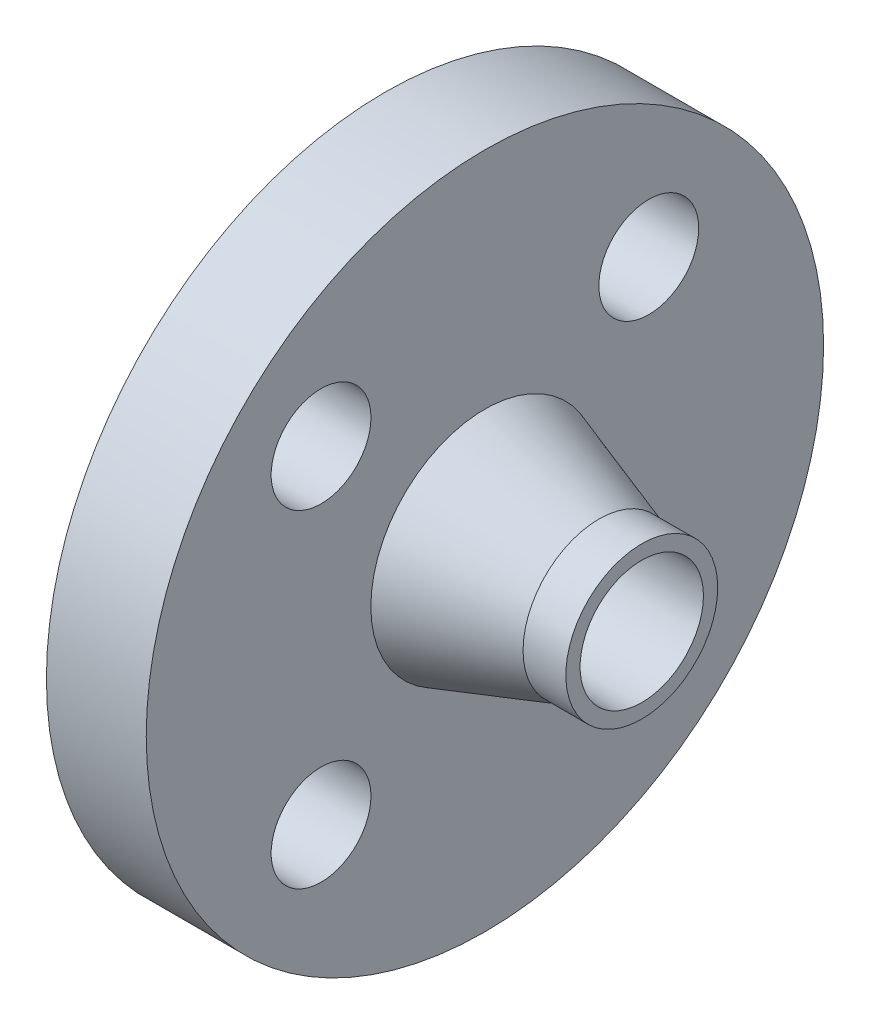
ISO-10303-21;
HEADER;
FILE_DESCRIPTION(('STEP AP214'),'2;1');
FILE_NAME('part.step','',(''),(''),'','','');
FILE_SCHEMA(('AUTOMOTIVE_DESIGN { 1 0 10303 214 1 1 1 1 }'));
ENDSEC;
DATA;
#1=APPLICATION_CONTEXT('core data for automotive mechanical design processes');
#2=APPLICATION_PROTOCOL_DEFINITION('international standard','automotive_design',2000,#1);
#3=PRODUCT_CONTEXT('',#1,'mechanical');
#4=PRODUCT('Part','Part','',(#3));
#5=PRODUCT_RELATED_PRODUCT_CATEGORY('part','',(#4));
#6=PRODUCT_DEFINITION_FORMATION('','',#4);
#7=PRODUCT_DEFINITION_CONTEXT('part definition',#1,'design');
#8=PRODUCT_DEFINITION('design','',#6,#7);
#9=PRODUCT_DEFINITION_SHAPE('','',#8);
#10=(LENGTH_UNIT() NAMED_UNIT(*) SI_UNIT(.MILLI.,.METRE.));
#11=(NAMED_UNIT(*) PLANE_ANGLE_UNIT() SI_UNIT($,.RADIAN.));
#12=(NAMED_UNIT(*) SI_UNIT($,.STERADIAN.) SOLID_ANGLE_UNIT());
#13=UNCERTAINTY_MEASURE_WITH_UNIT(LENGTH_MEASURE(1.E-05),#10,'distance_accuracy_value','');
#14=(GEOMETRIC_REPRESENTATION_CONTEXT(3) GLOBAL_UNCERTAINTY_ASSIGNED_CONTEXT((#13)) GLOBAL_UNIT_ASSIGNED_CONTEXT((#10,
#11,#12)) REPRESENTATION_CONTEXT('',''));
#15=CARTESIAN_POINT('',(0.,0.,0.));
#16=DIRECTION('',(0.,0.,1.));
#17=DIRECTION('',(1.,0.,0.));
#18=AXIS2_PLACEMENT_3D('',#15,#16,#17);
#19=CARTESIAN_POINT('',(0.,15.575,0.));
#20=DIRECTION('',(-1.,0.,0.));
#21=DIRECTION('',(0.,0.,1.));
#22=AXIS2_PLACEMENT_3D('',#19,#20,#21);
#23=PLANE('',#22);
#24=CARTESIAN_POINT('',(0.,0.,0.));
#25=DIRECTION('',(1.,0.,0.));
#26=DIRECTION('',(0.,0.,-1.));
#27=AXIS2_PLACEMENT_3D('',#24,#25,#26);
#28=CIRCLE('',#27,8.65);
#29=CARTESIAN_POINT('',(0.,0.,-8.65));
#30=VERTEX_POINT('',#29);
#31=EDGE_CURVE('E18',#30,#30,#28,.T.);
#32=ORIENTED_EDGE('',*,*,#31,.T.);
#33=EDGE_LOOP('',(#32));
#34=FACE_BOUND('',#33,.T.);
#35=CARTESIAN_POINT('',(0.,0.,0.));
#36=DIRECTION('',(1.,0.,0.));
#37=DIRECTION('',(0.,0.,-1.));
#38=AXIS2_PLACEMENT_3D('',#35,#36,#37);
#39=CIRCLE('',#38,22.5);
#40=CARTESIAN_POINT('',(0.,0.,-22.5));
#41=VERTEX_POINT('',#40);
#42=EDGE_CURVE('E68',#41,#41,#39,.T.);
#43=ORIENTED_EDGE('',*,*,#42,.F.);
#44=EDGE_LOOP('',(#43));
#45=FACE_BOUND('',#44,.T.);
#46=ADVANCED_FACE('F15',(#34,#45),#23,.T.);
#47=CARTESIAN_POINT('',(19.,0.,0.));
#48=DIRECTION('',(1.,0.,0.));
#49=DIRECTION('',(0.,0.,-1.));
#50=AXIS2_PLACEMENT_3D('',#47,#48,#49);
#51=CYLINDRICAL_SURFACE('',#50,8.65);
#52=CARTESIAN_POINT('',(38.,0.,0.));
#53=DIRECTION('',(1.,0.,0.));
#54=DIRECTION('',(0.,0.,-1.));
#55=AXIS2_PLACEMENT_3D('',#52,#53,#54);
#56=CIRCLE('',#55,8.65);
#57=CARTESIAN_POINT('',(38.,0.,-8.65));
#58=VERTEX_POINT('',#57);
#59=EDGE_CURVE('E66',#58,#58,#56,.F.);
#60=ORIENTED_EDGE('',*,*,#59,.F.);
#61=EDGE_LOOP('',(#60));
#62=FACE_BOUND('',#61,.T.);
#63=ORIENTED_EDGE('',*,*,#31,.F.);
#64=EDGE_LOOP('',(#63));
#65=FACE_BOUND('',#64,.T.);
#66=ADVANCED_FACE('F77',(#62,#65),#51,.F.);
#67=CARTESIAN_POINT('',(0.999999999999995,0.,0.));
#68=DIRECTION('',(1.,0.,0.));
#69=DIRECTION('',(0.,0.,-1.));
#70=AXIS2_PLACEMENT_3D('',#67,#68,#69);
#71=CYLINDRICAL_SURFACE('',#70,22.5);
#72=ORIENTED_EDGE('',*,*,#42,.T.);
#73=EDGE_LOOP('',(#72));
#74=FACE_BOUND('',#73,.T.);
#75=CARTESIAN_POINT('',(1.99999999999999,0.,0.));
#76=DIRECTION('',(1.,0.,0.));
#77=DIRECTION('',(0.,0.,-1.));
#78=AXIS2_PLACEMENT_3D('',#75,#76,#77);
#79=CIRCLE('',#78,22.5);
#80=CARTESIAN_POINT('',(1.99999999999999,0.,-22.5));
#81=VERTEX_POINT('',#80);
#82=EDGE_CURVE('E63',#81,#81,#79,.T.);
#83=ORIENTED_EDGE('',*,*,#82,.F.);
#84=EDGE_LOOP('',(#83));
#85=FACE_BOUND('',#84,.T.);
#86=ADVANCED_FACE('F79',(#74,#85),#71,.T.);
#87=CARTESIAN_POINT('',(38.,9.65,0.));
#88=DIRECTION('',(1.,0.,0.));
#89=DIRECTION('',(0.,0.,-1.));
#90=AXIS2_PLACEMENT_3D('',#87,#88,#89);
#91=PLANE('',#90);
#92=ORIENTED_EDGE('',*,*,#59,.T.);
#93=EDGE_LOOP('',(#92));
#94=FACE_BOUND('',#93,.T.);
#95=CARTESIAN_POINT('',(38.,0.,0.));
#96=DIRECTION('',(1.,0.,0.));
#97=DIRECTION('',(0.,0.,-1.));
#98=AXIS2_PLACEMENT_3D('',#95,#96,#97);
#99=CIRCLE('',#98,10.65);
#100=CARTESIAN_POINT('',(38.,0.,-10.65));
#101=VERTEX_POINT('',#100);
#102=EDGE_CURVE('E60',#101,#101,#99,.F.);
#103=ORIENTED_EDGE('',*,*,#102,.F.);
#104=EDGE_LOOP('',(#103));
#105=FACE_BOUND('',#104,.T.);
#106=ADVANCED_FACE('F86',(#94,#105),#91,.T.);
#107=CARTESIAN_POINT('',(1.99999999999999,35.,0.));
#108=DIRECTION('',(-1.,0.,0.));
#109=DIRECTION('',(0.,0.,1.));
#110=AXIS2_PLACEMENT_3D('',#107,#108,#109);
#111=PLANE('',#110);
#112=ORIENTED_EDGE('',*,*,#82,.T.);
#113=EDGE_LOOP('',(#112));
#114=FACE_BOUND('',#113,.T.);
#115=CARTESIAN_POINT('',(1.99999999999999,22.9809703885628,22.9809703885628));
#116=DIRECTION('',(1.,0.,0.));
#117=DIRECTION('',(0.,0.,-1.));
#118=AXIS2_PLACEMENT_3D('',#115,#116,#117);
#119=CIRCLE('',#118,7.);
#120=CARTESIAN_POINT('',(1.99999999999999,22.9809703885628,15.9809703885628));
#121=VERTEX_POINT('',#120);
#122=EDGE_CURVE('E45',#121,#121,#119,.T.);
#123=ORIENTED_EDGE('',*,*,#122,.T.);
#124=EDGE_LOOP('',(#123));
#125=FACE_BOUND('',#124,.T.);
#126=CARTESIAN_POINT('',(1.99999999999999,-22.9809703885628,22.9809703885628));
#127=DIRECTION('',(1.,0.,0.));
#128=DIRECTION('',(0.,0.,-1.));
#129=AXIS2_PLACEMENT_3D('',#126,#127,#128);
#130=CIRCLE('',#129,7.);
#131=CARTESIAN_POINT('',(1.99999999999999,-22.9809703885628,15.9809703885628));
#132=VERTEX_POINT('',#131);
#133=EDGE_CURVE('E48',#132,#132,#130,.T.);
#134=ORIENTED_EDGE('',*,*,#133,.T.);
#135=EDGE_LOOP('',(#134));
#136=FACE_BOUND('',#135,.T.);
#137=CARTESIAN_POINT('',(1.99999999999999,-22.9809703885628,-22.9809703885628));
#138=DIRECTION('',(1.,0.,0.));
#139=DIRECTION('',(0.,0.,-1.));
#140=AXIS2_PLACEMENT_3D('',#137,#138,#139);
#141=CIRCLE('',#140,7.);
#142=CARTESIAN_POINT('',(1.99999999999999,-22.9809703885628,-29.9809703885628));
#143=VERTEX_POINT('',#142);
#144=EDGE_CURVE('E51',#143,#143,#141,.T.);
#145=ORIENTED_EDGE('',*,*,#144,.T.);
#146=EDGE_LOOP('',(#145));
#147=FACE_BOUND('',#146,.T.);
#148=CARTESIAN_POINT('',(1.99999999999999,22.9809703885628,-22.9809703885628));
#149=DIRECTION('',(1.,0.,0.));
#150=DIRECTION('',(0.,0.,-1.));
#151=AXIS2_PLACEMENT_3D('',#148,#149,#150);
#152=CIRCLE('',#151,7.);
#153=CARTESIAN_POINT('',(1.99999999999999,22.9809703885628,-29.9809703885628));
#154=VERTEX_POINT('',#153);
#155=EDGE_CURVE('E54',#154,#154,#152,.T.);
#156=ORIENTED_EDGE('',*,*,#155,.T.);
#157=EDGE_LOOP('',(#156));
#158=FACE_BOUND('',#157,.T.);
#159=CARTESIAN_POINT('',(1.99999999999999,0.,0.));
#160=DIRECTION('',(1.,0.,0.));
#161=DIRECTION('',(0.,0.,-1.));
#162=AXIS2_PLACEMENT_3D('',#159,#160,#161);
#163=CIRCLE('',#162,47.5);
#164=CARTESIAN_POINT('',(1.99999999999999,0.,-47.5));
#165=VERTEX_POINT('',#164);
#166=EDGE_CURVE('E57',#165,#165,#163,.T.);
#167=ORIENTED_EDGE('',*,*,#166,.F.);
#168=EDGE_LOOP('',(#167));
#169=FACE_BOUND('',#168,.T.);
#170=ADVANCED_FACE('F123',(#114,#125,#136,#147,#158,#169),#111,.T.);
#171=CARTESIAN_POINT('',(35.,0.,0.));
#172=DIRECTION('',(1.,0.,0.));
#173=DIRECTION('',(0.,0.,-1.));
#174=AXIS2_PLACEMENT_3D('',#171,#172,#173);
#175=CYLINDRICAL_SURFACE('',#174,10.65);
#176=CARTESIAN_POINT('',(32.0000000009863,0.,0.));
#177=DIRECTION('',(-1.,0.,0.));
#178=DIRECTION('',(0.,1.,0.));
#179=AXIS2_PLACEMENT_3D('',#176,#177,#178);
#180=CIRCLE('',#179,10.6500000029498);
#181=CARTESIAN_POINT('',(32.0000000009863,10.6500000029498,0.));
#182=VERTEX_POINT('',#181);
#183=EDGE_CURVE('E44',#182,#182,#180,.T.);
#184=ORIENTED_EDGE('',*,*,#183,.F.);
#185=EDGE_LOOP('',(#184));
#186=FACE_BOUND('',#185,.T.);
#187=ORIENTED_EDGE('',*,*,#102,.T.);
#188=EDGE_LOOP('',(#187));
#189=FACE_BOUND('',#188,.T.);
#190=ADVANCED_FACE('F119',(#186,#189),#175,.T.);
#191=CARTESIAN_POINT('',(8.99999999999999,0.,0.));
#192=DIRECTION('',(1.,0.,0.));
#193=DIRECTION('',(0.,0.,-1.));
#194=AXIS2_PLACEMENT_3D('',#191,#192,#193);
#195=CYLINDRICAL_SURFACE('',#194,47.5);
#196=ORIENTED_EDGE('',*,*,#166,.T.);
#197=EDGE_LOOP('',(#196));
#198=FACE_BOUND('',#197,.T.);
#199=CARTESIAN_POINT('',(16.,0.,0.));
#200=DIRECTION('',(1.,0.,0.));
#201=DIRECTION('',(0.,0.,-1.));
#202=AXIS2_PLACEMENT_3D('',#199,#200,#201);
#203=CIRCLE('',#202,47.5);
#204=CARTESIAN_POINT('',(16.,0.,-47.5));
#205=VERTEX_POINT('',#204);
#206=EDGE_CURVE('E41',#205,#205,#203,.T.);
#207=ORIENTED_EDGE('',*,*,#206,.F.);
#208=EDGE_LOOP('',(#207));
#209=FACE_BOUND('',#208,.T.);
#210=ADVANCED_FACE('F115',(#198,#209),#195,.T.);
#211=CARTESIAN_POINT('',(1.99999999999999,22.9809703885628,-22.9809703885628));
#212=DIRECTION('',(1.,0.,0.));
#213=DIRECTION('',(0.,0.,-1.));
#214=AXIS2_PLACEMENT_3D('',#211,#212,#213);
#215=CYLINDRICAL_SURFACE('',#214,7.);
#216=ORIENTED_EDGE('',*,*,#155,.F.);
#217=EDGE_LOOP('',(#216));
#218=FACE_BOUND('',#217,.T.);
#219=CARTESIAN_POINT('',(16.,22.9809703885628,-22.9809703885628));
#220=DIRECTION('',(1.,0.,0.));
#221=DIRECTION('',(0.,0.,-1.));
#222=AXIS2_PLACEMENT_3D('',#219,#220,#221);
#223=CIRCLE('',#222,7.);
#224=CARTESIAN_POINT('',(16.,22.9809703885628,-29.9809703885628));
#225=VERTEX_POINT('',#224);
#226=EDGE_CURVE('E38',#225,#225,#223,.F.);
#227=ORIENTED_EDGE('',*,*,#226,.F.);
#228=EDGE_LOOP('',(#227));
#229=FACE_BOUND('',#228,.T.);
#230=ADVANCED_FACE('F111',(#218,#229),#215,.F.);
#231=CARTESIAN_POINT('',(1.99999999999999,-22.9809703885628,-22.9809703885628));
#232=DIRECTION('',(1.,0.,0.));
#233=DIRECTION('',(0.,0.,-1.));
#234=AXIS2_PLACEMENT_3D('',#231,#232,#233);
#235=CYLINDRICAL_SURFACE('',#234,7.);
#236=ORIENTED_EDGE('',*,*,#144,.F.);
#237=EDGE_LOOP('',(#236));
#238=FACE_BOUND('',#237,.T.);
#239=CARTESIAN_POINT('',(16.,-22.9809703885628,-22.9809703885628));
#240=DIRECTION('',(1.,0.,0.));
#241=DIRECTION('',(0.,0.,-1.));
#242=AXIS2_PLACEMENT_3D('',#239,#240,#241);
#243=CIRCLE('',#242,7.);
#244=CARTESIAN_POINT('',(16.,-22.9809703885628,-29.9809703885628));
#245=VERTEX_POINT('',#244);
#246=EDGE_CURVE('E35',#245,#245,#243,.F.);
#247=ORIENTED_EDGE('',*,*,#246,.F.);
#248=EDGE_LOOP('',(#247));
#249=FACE_BOUND('',#248,.T.);
#250=ADVANCED_FACE('F107',(#238,#249),#235,.F.);
#251=CARTESIAN_POINT('',(1.99999999999999,-22.9809703885628,22.9809703885628));
#252=DIRECTION('',(1.,0.,0.));
#253=DIRECTION('',(0.,0.,-1.));
#254=AXIS2_PLACEMENT_3D('',#251,#252,#253);
#255=CYLINDRICAL_SURFACE('',#254,7.);
#256=ORIENTED_EDGE('',*,*,#133,.F.);
#257=EDGE_LOOP('',(#256));
#258=FACE_BOUND('',#257,.T.);
#259=CARTESIAN_POINT('',(16.,-22.9809703885628,22.9809703885628));
#260=DIRECTION('',(1.,0.,0.));
#261=DIRECTION('',(0.,0.,-1.));
#262=AXIS2_PLACEMENT_3D('',#259,#260,#261);
#263=CIRCLE('',#262,7.);
#264=CARTESIAN_POINT('',(16.,-22.9809703885628,15.9809703885628));
#265=VERTEX_POINT('',#264);
#266=EDGE_CURVE('E27',#265,#265,#263,.F.);
#267=ORIENTED_EDGE('',*,*,#266,.F.);
#268=EDGE_LOOP('',(#267));
#269=FACE_BOUND('',#268,.T.);
#270=ADVANCED_FACE('F103',(#258,#269),#255,.F.);
#271=CARTESIAN_POINT('',(1.99999999999999,22.9809703885628,22.9809703885628));
#272=DIRECTION('',(1.,0.,0.));
#273=DIRECTION('',(0.,0.,-1.));
#274=AXIS2_PLACEMENT_3D('',#271,#272,#273);
#275=CYLINDRICAL_SURFACE('',#274,7.);
#276=ORIENTED_EDGE('',*,*,#122,.F.);
#277=EDGE_LOOP('',(#276));
#278=FACE_BOUND('',#277,.T.);
#279=CARTESIAN_POINT('',(16.,22.9809703885628,22.9809703885628));
#280=DIRECTION('',(1.,0.,0.));
#281=DIRECTION('',(0.,0.,-1.));
#282=AXIS2_PLACEMENT_3D('',#279,#280,#281);
#283=CIRCLE('',#282,7.);
#284=CARTESIAN_POINT('',(16.,22.9809703885628,15.9809703885628));
#285=VERTEX_POINT('',#284);
#286=EDGE_CURVE('E22',#285,#285,#283,.F.);
#287=ORIENTED_EDGE('',*,*,#286,.F.);
#288=EDGE_LOOP('',(#287));
#289=FACE_BOUND('',#288,.T.);
#290=ADVANCED_FACE('F96',(#278,#289),#275,.F.);
#291=CARTESIAN_POINT('',(15.9999999990137,0.,0.));
#292=DIRECTION('',(-1.,0.,0.));
#293=DIRECTION('',(0.,0.,1.));
#294=AXIS2_PLACEMENT_3D('',#291,#292,#293);
#295=CONICAL_SURFACE('',#294,15.9999999970502,0.322687760876291);
#296=CARTESIAN_POINT('',(15.9999999990137,0.,0.));
#297=DIRECTION('',(-1.,0.,0.));
#298=DIRECTION('',(0.,0.,1.));
#299=AXIS2_PLACEMENT_3D('',#296,#297,#298);
#300=CIRCLE('',#299,15.9999999970502);
#301=CARTESIAN_POINT('',(15.9999999990137,0.,15.9999999970502));
#302=VERTEX_POINT('',#301);
#303=EDGE_CURVE('E10',#302,#302,#300,.T.);
#304=ORIENTED_EDGE('',*,*,#303,.F.);
#305=EDGE_LOOP('',(#304));
#306=FACE_BOUND('',#305,.T.);
#307=ORIENTED_EDGE('',*,*,#183,.T.);
#308=EDGE_LOOP('',(#307));
#309=FACE_BOUND('',#308,.T.);
#310=ADVANCED_FACE('F91',(#306,#309),#295,.T.);
#311=CARTESIAN_POINT('',(16.,31.75,0.));
#312=DIRECTION('',(1.,0.,0.));
#313=DIRECTION('',(0.,0.,-1.));
#314=AXIS2_PLACEMENT_3D('',#311,#312,#313);
#315=PLANE('',#314);
#316=ORIENTED_EDGE('',*,*,#303,.T.);
#317=EDGE_LOOP('',(#316));
#318=FACE_BOUND('',#317,.T.);
#319=ORIENTED_EDGE('',*,*,#286,.T.);
#320=EDGE_LOOP('',(#319));
#321=FACE_BOUND('',#320,.T.);
#322=ORIENTED_EDGE('',*,*,#266,.T.);
#323=EDGE_LOOP('',(#322));
#324=FACE_BOUND('',#323,.T.);
#325=ORIENTED_EDGE('',*,*,#246,.T.);
#326=EDGE_LOOP('',(#325));
#327=FACE_BOUND('',#326,.T.);
#328=ORIENTED_EDGE('',*,*,#226,.T.);
#329=EDGE_LOOP('',(#328));
#330=FACE_BOUND('',#329,.T.);
#331=ORIENTED_EDGE('',*,*,#206,.T.);
#332=EDGE_LOOP('',(#331));
#333=FACE_BOUND('',#332,.T.);
#334=ADVANCED_FACE('F89',(#318,#321,#324,#327,#330,#333),#315,.T.);
#335=CLOSED_SHELL('',(#46,#66,#86,#106,#170,#190,#210,#230,#250,#270,#290,#310,#334));
#336=MANIFOLD_SOLID_BREP('B1',#335);
#337=ADVANCED_BREP_SHAPE_REPRESENTATION('',(#18,#336),#14);
#338=SHAPE_DEFINITION_REPRESENTATION(#9,#337);
ENDSEC;
END-ISO-10303-21;
